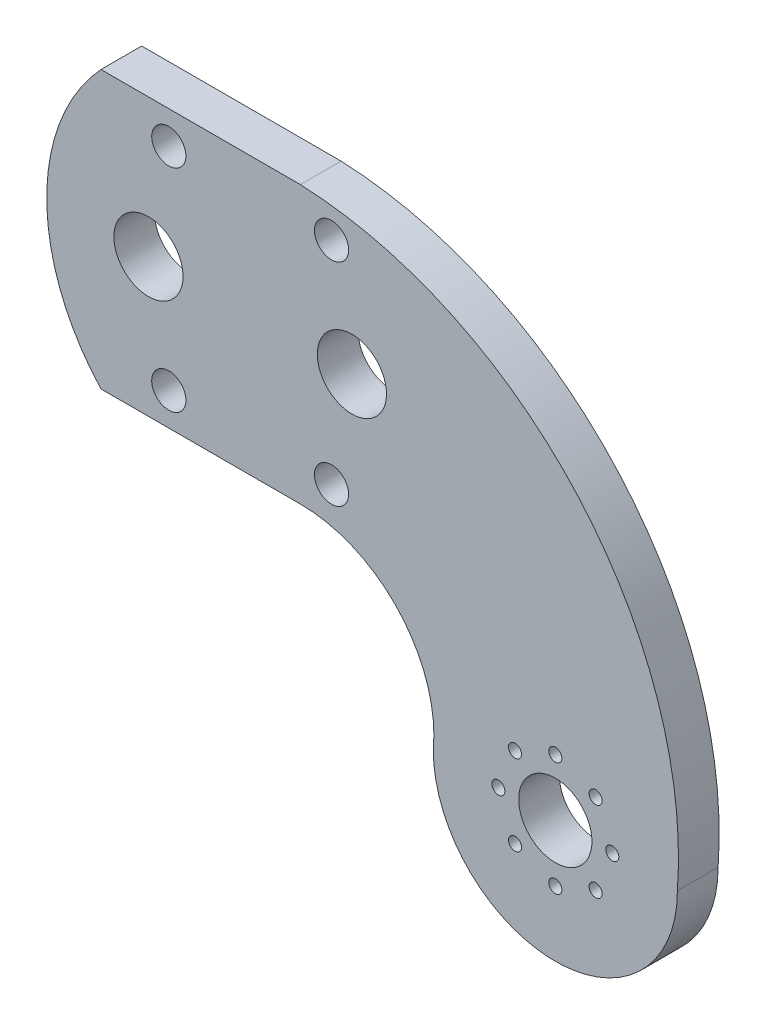
ISO-10303-21;
HEADER;
FILE_DESCRIPTION(('STEP AP214'),'2;1');
FILE_NAME('part.step','',(''),(''),'','','');
FILE_SCHEMA(('AUTOMOTIVE_DESIGN { 1 0 10303 214 1 1 1 1 }'));
ENDSEC;
DATA;
#1=APPLICATION_CONTEXT('core data for automotive mechanical design processes');
#2=APPLICATION_PROTOCOL_DEFINITION('international standard','automotive_design',2000,#1);
#3=PRODUCT_CONTEXT('',#1,'mechanical');
#4=PRODUCT('Part','Part','',(#3));
#5=PRODUCT_RELATED_PRODUCT_CATEGORY('part','',(#4));
#6=PRODUCT_DEFINITION_FORMATION('','',#4);
#7=PRODUCT_DEFINITION_CONTEXT('part definition',#1,'design');
#8=PRODUCT_DEFINITION('design','',#6,#7);
#9=PRODUCT_DEFINITION_SHAPE('','',#8);
#10=(LENGTH_UNIT() NAMED_UNIT(*) SI_UNIT(.MILLI.,.METRE.));
#11=(NAMED_UNIT(*) PLANE_ANGLE_UNIT() SI_UNIT($,.RADIAN.));
#12=(NAMED_UNIT(*) SI_UNIT($,.STERADIAN.) SOLID_ANGLE_UNIT());
#13=UNCERTAINTY_MEASURE_WITH_UNIT(LENGTH_MEASURE(1.E-05),#10,'distance_accuracy_value','');
#14=(GEOMETRIC_REPRESENTATION_CONTEXT(3) GLOBAL_UNCERTAINTY_ASSIGNED_CONTEXT((#13)) GLOBAL_UNIT_ASSIGNED_CONTEXT((#10,
#11,#12)) REPRESENTATION_CONTEXT('',''));
#15=CARTESIAN_POINT('',(0.,0.,0.));
#16=DIRECTION('',(0.,0.,1.));
#17=DIRECTION('',(1.,0.,0.));
#18=AXIS2_PLACEMENT_3D('',#15,#16,#17);
#19=CARTESIAN_POINT('',(-8.33060356798812,-31.4216530640273,5.));
#20=DIRECTION('',(0.,0.,-1.));
#21=DIRECTION('',(-1.,0.,0.));
#22=AXIS2_PLACEMENT_3D('',#19,#20,#21);
#23=CYLINDRICAL_SURFACE('',#22,48.4628910408801);
#24=CARTESIAN_POINT('',(-8.33060356798812,-31.4216530640273,0.));
#25=DIRECTION('',(0.,0.,1.));
#26=DIRECTION('',(1.,0.,0.));
#27=AXIS2_PLACEMENT_3D('',#24,#25,#26);
#28=CIRCLE('',#27,48.4628910408801);
#29=CARTESIAN_POINT('',(-6.33177326323588,17.,0.));
#30=VERTEX_POINT('',#29);
#31=CARTESIAN_POINT('',(40.,-35.,0.));
#32=VERTEX_POINT('',#31);
#33=EDGE_CURVE('E161',#30,#32,#28,.F.);
#34=ORIENTED_EDGE('',*,*,#33,.F.);
#35=DIRECTION('',(0.,0.,-1.));
#36=VECTOR('',#35,1.);
#37=CARTESIAN_POINT('',(-6.33177326323588,17.,5.));
#38=LINE('',#37,#36);
#39=CARTESIAN_POINT('',(-6.33177326323588,17.,5.));
#40=VERTEX_POINT('',#39);
#41=EDGE_CURVE('E11',#40,#30,#38,.T.);
#42=ORIENTED_EDGE('',*,*,#41,.F.);
#43=CARTESIAN_POINT('',(-8.33060356798812,-31.4216530640273,5.));
#44=DIRECTION('',(0.,0.,1.));
#45=DIRECTION('',(1.,0.,0.));
#46=AXIS2_PLACEMENT_3D('',#43,#44,#45);
#47=CIRCLE('',#46,48.4628910408801);
#48=CARTESIAN_POINT('',(40.,-35.,5.));
#49=VERTEX_POINT('',#48);
#50=EDGE_CURVE('E218',#40,#49,#47,.F.);
#51=ORIENTED_EDGE('',*,*,#50,.T.);
#52=DIRECTION('',(0.,0.,-1.));
#53=VECTOR('',#52,1.);
#54=CARTESIAN_POINT('',(40.,-35.,5.));
#55=LINE('',#54,#53);
#56=EDGE_CURVE('E79',#49,#32,#55,.T.);
#57=ORIENTED_EDGE('',*,*,#56,.T.);
#58=EDGE_LOOP('',(#34,#42,#51,#57));
#59=FACE_BOUND('',#58,.T.);
#60=ADVANCED_FACE('F34',(#59),#23,.T.);
#61=CARTESIAN_POINT('',(0.,17.,5.));
#62=DIRECTION('',(0.,1.,0.));
#63=DIRECTION('',(0.,0.,1.));
#64=AXIS2_PLACEMENT_3D('',#61,#62,#63);
#65=PLANE('',#64);
#66=DIRECTION('',(1.,0.,0.));
#67=VECTOR('',#66,1.);
#68=CARTESIAN_POINT('',(0.,17.,0.));
#69=LINE('',#68,#67);
#70=CARTESIAN_POINT('',(-30.8303027798234,17.,0.));
#71=VERTEX_POINT('',#70);
#72=EDGE_CURVE('E164',#71,#30,#69,.T.);
#73=ORIENTED_EDGE('',*,*,#72,.F.);
#74=DIRECTION('',(0.,0.,-1.));
#75=VECTOR('',#74,1.);
#76=CARTESIAN_POINT('',(-30.8303027798234,17.,5.));
#77=LINE('',#76,#75);
#78=CARTESIAN_POINT('',(-30.8303027798234,17.,5.));
#79=VERTEX_POINT('',#78);
#80=EDGE_CURVE('E42',#79,#71,#77,.T.);
#81=ORIENTED_EDGE('',*,*,#80,.F.);
#82=DIRECTION('',(1.,0.,0.));
#83=VECTOR('',#82,1.);
#84=CARTESIAN_POINT('',(0.,17.,5.));
#85=LINE('',#84,#83);
#86=EDGE_CURVE('E231',#79,#40,#85,.T.);
#87=ORIENTED_EDGE('',*,*,#86,.T.);
#88=ORIENTED_EDGE('',*,*,#41,.T.);
#89=EDGE_LOOP('',(#73,#81,#87,#88));
#90=FACE_BOUND('',#89,.T.);
#91=ADVANCED_FACE('F230',(#90),#65,.T.);
#92=CARTESIAN_POINT('',(-12.5,0.,5.));
#93=DIRECTION('',(0.,0.,-1.));
#94=DIRECTION('',(-1.,0.,0.));
#95=AXIS2_PLACEMENT_3D('',#92,#93,#94);
#96=CYLINDRICAL_SURFACE('',#95,25.);
#97=CARTESIAN_POINT('',(-12.5,0.,0.));
#98=DIRECTION('',(0.,0.,1.));
#99=DIRECTION('',(1.,0.,0.));
#100=AXIS2_PLACEMENT_3D('',#97,#98,#99);
#101=CIRCLE('',#100,25.);
#102=CARTESIAN_POINT('',(-30.8303027798234,-17.,0.));
#103=VERTEX_POINT('',#102);
#104=EDGE_CURVE('E167',#71,#103,#101,.T.);
#105=ORIENTED_EDGE('',*,*,#104,.T.);
#106=DIRECTION('',(0.,0.,-1.));
#107=VECTOR('',#106,1.);
#108=CARTESIAN_POINT('',(-30.8303027798234,-17.,5.));
#109=LINE('',#108,#107);
#110=CARTESIAN_POINT('',(-30.8303027798234,-17.,5.));
#111=VERTEX_POINT('',#110);
#112=EDGE_CURVE('E108',#111,#103,#109,.T.);
#113=ORIENTED_EDGE('',*,*,#112,.F.);
#114=CARTESIAN_POINT('',(-12.5,0.,5.));
#115=DIRECTION('',(0.,0.,1.));
#116=DIRECTION('',(1.,0.,0.));
#117=AXIS2_PLACEMENT_3D('',#114,#115,#116);
#118=CIRCLE('',#117,25.);
#119=EDGE_CURVE('E99',#79,#111,#118,.T.);
#120=ORIENTED_EDGE('',*,*,#119,.F.);
#121=ORIENTED_EDGE('',*,*,#80,.T.);
#122=EDGE_LOOP('',(#105,#113,#120,#121));
#123=FACE_BOUND('',#122,.T.);
#124=ADVANCED_FACE('F223',(#123),#96,.T.);
#125=CARTESIAN_POINT('',(0.,-17.,5.));
#126=DIRECTION('',(0.,1.,0.));
#127=DIRECTION('',(0.,0.,1.));
#128=AXIS2_PLACEMENT_3D('',#125,#126,#127);
#129=PLANE('',#128);
#130=DIRECTION('',(1.,0.,0.));
#131=VECTOR('',#130,1.);
#132=CARTESIAN_POINT('',(0.,-17.,0.));
#133=LINE('',#132,#131);
#134=CARTESIAN_POINT('',(-6.33177326323588,-17.,0.));
#135=VERTEX_POINT('',#134);
#136=EDGE_CURVE('E107',#103,#135,#133,.T.);
#137=ORIENTED_EDGE('',*,*,#136,.T.);
#138=DIRECTION('',(0.,0.,-1.));
#139=VECTOR('',#138,1.);
#140=CARTESIAN_POINT('',(-6.33177326323588,-17.,5.));
#141=LINE('',#140,#139);
#142=CARTESIAN_POINT('',(-6.33177326323588,-17.,5.));
#143=VERTEX_POINT('',#142);
#144=EDGE_CURVE('E104',#143,#135,#141,.T.);
#145=ORIENTED_EDGE('',*,*,#144,.F.);
#146=DIRECTION('',(1.,0.,0.));
#147=VECTOR('',#146,1.);
#148=CARTESIAN_POINT('',(0.,-17.,5.));
#149=LINE('',#148,#147);
#150=EDGE_CURVE('E91',#111,#143,#149,.T.);
#151=ORIENTED_EDGE('',*,*,#150,.F.);
#152=ORIENTED_EDGE('',*,*,#112,.T.);
#153=EDGE_LOOP('',(#137,#145,#151,#152));
#154=FACE_BOUND('',#153,.T.);
#155=ADVANCED_FACE('F105',(#154),#129,.F.);
#156=CARTESIAN_POINT('',(-6.33180988003462,-33.4091114987849,5.));
#157=DIRECTION('',(0.,0.,-1.));
#158=DIRECTION('',(-1.,0.,0.));
#159=AXIS2_PLACEMENT_3D('',#156,#157,#158);
#160=CYLINDRICAL_SURFACE('',#159,16.4091114988257);
#161=CARTESIAN_POINT('',(-6.33180988003462,-33.4091114987849,0.));
#162=DIRECTION('',(0.,0.,1.));
#163=DIRECTION('',(1.,0.,0.));
#164=AXIS2_PLACEMENT_3D('',#161,#162,#163);
#165=CIRCLE('',#164,16.4091114988257);
#166=CARTESIAN_POINT('',(9.99999999999997,-35.,0.));
#167=VERTEX_POINT('',#166);
#168=EDGE_CURVE('E72',#135,#167,#165,.F.);
#169=ORIENTED_EDGE('',*,*,#168,.T.);
#170=DIRECTION('',(0.,0.,-1.));
#171=VECTOR('',#170,1.);
#172=CARTESIAN_POINT('',(9.99999999999997,-35.,5.));
#173=LINE('',#172,#171);
#174=CARTESIAN_POINT('',(9.99999999999997,-35.,5.));
#175=VERTEX_POINT('',#174);
#176=EDGE_CURVE('E109',#175,#167,#173,.T.);
#177=ORIENTED_EDGE('',*,*,#176,.F.);
#178=CARTESIAN_POINT('',(-6.33180988003462,-33.4091114987849,5.));
#179=DIRECTION('',(0.,0.,1.));
#180=DIRECTION('',(1.,0.,0.));
#181=AXIS2_PLACEMENT_3D('',#178,#179,#180);
#182=CIRCLE('',#181,16.4091114988257);
#183=EDGE_CURVE('E96',#143,#175,#182,.F.);
#184=ORIENTED_EDGE('',*,*,#183,.F.);
#185=ORIENTED_EDGE('',*,*,#144,.T.);
#186=EDGE_LOOP('',(#169,#177,#184,#185));
#187=FACE_BOUND('',#186,.T.);
#188=ADVANCED_FACE('F111',(#187),#160,.F.);
#189=CARTESIAN_POINT('',(20.0502525316942,-30.0502525316942,5.));
#190=DIRECTION('',(0.,0.,-1.));
#191=DIRECTION('',(-1.,0.,0.));
#192=AXIS2_PLACEMENT_3D('',#189,#190,#191);
#193=CYLINDRICAL_SURFACE('',#192,0.800000000000002);
#194=CARTESIAN_POINT('',(20.0502525316942,-30.0502525316942,5.));
#195=DIRECTION('',(0.,0.,1.));
#196=DIRECTION('',(1.,0.,0.));
#197=AXIS2_PLACEMENT_3D('',#194,#195,#196);
#198=CIRCLE('',#197,0.800000000000002);
#199=CARTESIAN_POINT('',(20.8502525316942,-30.0502525316942,5.));
#200=VERTEX_POINT('',#199);
#201=EDGE_CURVE('E155',#200,#200,#198,.T.);
#202=ORIENTED_EDGE('',*,*,#201,.T.);
#203=EDGE_LOOP('',(#202));
#204=FACE_BOUND('',#203,.T.);
#205=CARTESIAN_POINT('',(20.0502525316942,-30.0502525316942,0.));
#206=DIRECTION('',(0.,0.,1.));
#207=DIRECTION('',(1.,0.,0.));
#208=AXIS2_PLACEMENT_3D('',#205,#206,#207);
#209=CIRCLE('',#208,0.800000000000002);
#210=CARTESIAN_POINT('',(20.8502525316942,-30.0502525316942,0.));
#211=VERTEX_POINT('',#210);
#212=EDGE_CURVE('E212',#211,#211,#209,.T.);
#213=ORIENTED_EDGE('',*,*,#212,.F.);
#214=EDGE_LOOP('',(#213));
#215=FACE_BOUND('',#214,.T.);
#216=ADVANCED_FACE('F262',(#204,#215),#193,.F.);
#217=CARTESIAN_POINT('',(18.,-35.,5.));
#218=DIRECTION('',(0.,0.,-1.));
#219=DIRECTION('',(-1.,0.,0.));
#220=AXIS2_PLACEMENT_3D('',#217,#218,#219);
#221=CYLINDRICAL_SURFACE('',#220,0.8);
#222=CARTESIAN_POINT('',(18.,-35.,5.));
#223=DIRECTION('',(0.,0.,1.));
#224=DIRECTION('',(1.,0.,0.));
#225=AXIS2_PLACEMENT_3D('',#222,#223,#224);
#226=CIRCLE('',#225,0.8);
#227=CARTESIAN_POINT('',(18.8,-35.,5.));
#228=VERTEX_POINT('',#227);
#229=EDGE_CURVE('E152',#228,#228,#226,.T.);
#230=ORIENTED_EDGE('',*,*,#229,.T.);
#231=EDGE_LOOP('',(#230));
#232=FACE_BOUND('',#231,.T.);
#233=CARTESIAN_POINT('',(18.,-35.,0.));
#234=DIRECTION('',(0.,0.,1.));
#235=DIRECTION('',(1.,0.,0.));
#236=AXIS2_PLACEMENT_3D('',#233,#234,#235);
#237=CIRCLE('',#236,0.8);
#238=CARTESIAN_POINT('',(18.8,-35.,0.));
#239=VERTEX_POINT('',#238);
#240=EDGE_CURVE('E209',#239,#239,#237,.T.);
#241=ORIENTED_EDGE('',*,*,#240,.F.);
#242=EDGE_LOOP('',(#241));
#243=FACE_BOUND('',#242,.T.);
#244=ADVANCED_FACE('F266',(#232,#243),#221,.F.);
#245=CARTESIAN_POINT('',(20.0502525316941,-39.9497474683058,5.));
#246=DIRECTION('',(0.,0.,-1.));
#247=DIRECTION('',(-1.,0.,0.));
#248=AXIS2_PLACEMENT_3D('',#245,#246,#247);
#249=CYLINDRICAL_SURFACE('',#248,0.800000000000002);
#250=CARTESIAN_POINT('',(20.0502525316941,-39.9497474683058,5.));
#251=DIRECTION('',(0.,0.,1.));
#252=DIRECTION('',(1.,0.,0.));
#253=AXIS2_PLACEMENT_3D('',#250,#251,#252);
#254=CIRCLE('',#253,0.800000000000002);
#255=CARTESIAN_POINT('',(20.8502525316941,-39.9497474683058,5.));
#256=VERTEX_POINT('',#255);
#257=EDGE_CURVE('E149',#256,#256,#254,.T.);
#258=ORIENTED_EDGE('',*,*,#257,.T.);
#259=EDGE_LOOP('',(#258));
#260=FACE_BOUND('',#259,.T.);
#261=CARTESIAN_POINT('',(20.0502525316941,-39.9497474683058,0.));
#262=DIRECTION('',(0.,0.,1.));
#263=DIRECTION('',(1.,0.,0.));
#264=AXIS2_PLACEMENT_3D('',#261,#262,#263);
#265=CIRCLE('',#264,0.800000000000002);
#266=CARTESIAN_POINT('',(20.8502525316941,-39.9497474683058,0.));
#267=VERTEX_POINT('',#266);
#268=EDGE_CURVE('E206',#267,#267,#265,.T.);
#269=ORIENTED_EDGE('',*,*,#268,.F.);
#270=EDGE_LOOP('',(#269));
#271=FACE_BOUND('',#270,.T.);
#272=ADVANCED_FACE('F272',(#260,#271),#249,.F.);
#273=CARTESIAN_POINT('',(24.9999999999999,-42.,5.));
#274=DIRECTION('',(0.,0.,-1.));
#275=DIRECTION('',(-1.,0.,0.));
#276=AXIS2_PLACEMENT_3D('',#273,#274,#275);
#277=CYLINDRICAL_SURFACE('',#276,0.799999999999999);
#278=CARTESIAN_POINT('',(24.9999999999999,-42.,5.));
#279=DIRECTION('',(0.,0.,1.));
#280=DIRECTION('',(1.,0.,0.));
#281=AXIS2_PLACEMENT_3D('',#278,#279,#280);
#282=CIRCLE('',#281,0.799999999999999);
#283=CARTESIAN_POINT('',(25.7999999999999,-42.,5.));
#284=VERTEX_POINT('',#283);
#285=EDGE_CURVE('E146',#284,#284,#282,.T.);
#286=ORIENTED_EDGE('',*,*,#285,.T.);
#287=EDGE_LOOP('',(#286));
#288=FACE_BOUND('',#287,.T.);
#289=CARTESIAN_POINT('',(24.9999999999999,-42.,0.));
#290=DIRECTION('',(0.,0.,1.));
#291=DIRECTION('',(1.,0.,0.));
#292=AXIS2_PLACEMENT_3D('',#289,#290,#291);
#293=CIRCLE('',#292,0.799999999999999);
#294=CARTESIAN_POINT('',(25.7999999999999,-42.,0.));
#295=VERTEX_POINT('',#294);
#296=EDGE_CURVE('E203',#295,#295,#293,.T.);
#297=ORIENTED_EDGE('',*,*,#296,.F.);
#298=EDGE_LOOP('',(#297));
#299=FACE_BOUND('',#298,.T.);
#300=ADVANCED_FACE('F280',(#288,#299),#277,.F.);
#301=CARTESIAN_POINT('',(29.9497474683058,-39.9497474683059,5.));
#302=DIRECTION('',(0.,0.,-1.));
#303=DIRECTION('',(-1.,0.,0.));
#304=AXIS2_PLACEMENT_3D('',#301,#302,#303);
#305=CYLINDRICAL_SURFACE('',#304,0.799999999999999);
#306=CARTESIAN_POINT('',(29.9497474683058,-39.9497474683059,5.));
#307=DIRECTION('',(0.,0.,1.));
#308=DIRECTION('',(1.,0.,0.));
#309=AXIS2_PLACEMENT_3D('',#306,#307,#308);
#310=CIRCLE('',#309,0.799999999999999);
#311=CARTESIAN_POINT('',(30.7497474683058,-39.9497474683059,5.));
#312=VERTEX_POINT('',#311);
#313=EDGE_CURVE('E143',#312,#312,#310,.T.);
#314=ORIENTED_EDGE('',*,*,#313,.T.);
#315=EDGE_LOOP('',(#314));
#316=FACE_BOUND('',#315,.T.);
#317=CARTESIAN_POINT('',(29.9497474683058,-39.9497474683059,0.));
#318=DIRECTION('',(0.,0.,1.));
#319=DIRECTION('',(1.,0.,0.));
#320=AXIS2_PLACEMENT_3D('',#317,#318,#319);
#321=CIRCLE('',#320,0.799999999999999);
#322=CARTESIAN_POINT('',(30.7497474683058,-39.9497474683059,0.));
#323=VERTEX_POINT('',#322);
#324=EDGE_CURVE('E200',#323,#323,#321,.T.);
#325=ORIENTED_EDGE('',*,*,#324,.F.);
#326=EDGE_LOOP('',(#325));
#327=FACE_BOUND('',#326,.T.);
#328=ADVANCED_FACE('F284',(#316,#327),#305,.F.);
#329=CARTESIAN_POINT('',(32.,-35.,5.));
#330=DIRECTION('',(0.,0.,-1.));
#331=DIRECTION('',(-1.,0.,0.));
#332=AXIS2_PLACEMENT_3D('',#329,#330,#331);
#333=CYLINDRICAL_SURFACE('',#332,0.800000000000004);
#334=CARTESIAN_POINT('',(32.,-35.,5.));
#335=DIRECTION('',(0.,0.,1.));
#336=DIRECTION('',(1.,0.,0.));
#337=AXIS2_PLACEMENT_3D('',#334,#335,#336);
#338=CIRCLE('',#337,0.800000000000004);
#339=CARTESIAN_POINT('',(32.8,-35.,5.));
#340=VERTEX_POINT('',#339);
#341=EDGE_CURVE('E140',#340,#340,#338,.T.);
#342=ORIENTED_EDGE('',*,*,#341,.T.);
#343=EDGE_LOOP('',(#342));
#344=FACE_BOUND('',#343,.T.);
#345=CARTESIAN_POINT('',(32.,-35.,0.));
#346=DIRECTION('',(0.,0.,1.));
#347=DIRECTION('',(1.,0.,0.));
#348=AXIS2_PLACEMENT_3D('',#345,#346,#347);
#349=CIRCLE('',#348,0.800000000000004);
#350=CARTESIAN_POINT('',(32.8,-35.,0.));
#351=VERTEX_POINT('',#350);
#352=EDGE_CURVE('E197',#351,#351,#349,.T.);
#353=ORIENTED_EDGE('',*,*,#352,.F.);
#354=EDGE_LOOP('',(#353));
#355=FACE_BOUND('',#354,.T.);
#356=ADVANCED_FACE('F288',(#344,#355),#333,.F.);
#357=CARTESIAN_POINT('',(29.9497474683059,-30.0502525316942,5.));
#358=DIRECTION('',(0.,0.,-1.));
#359=DIRECTION('',(-1.,0.,0.));
#360=AXIS2_PLACEMENT_3D('',#357,#358,#359);
#361=CYLINDRICAL_SURFACE('',#360,0.799999999999999);
#362=CARTESIAN_POINT('',(29.9497474683059,-30.0502525316942,5.));
#363=DIRECTION('',(0.,0.,1.));
#364=DIRECTION('',(1.,0.,0.));
#365=AXIS2_PLACEMENT_3D('',#362,#363,#364);
#366=CIRCLE('',#365,0.799999999999999);
#367=CARTESIAN_POINT('',(30.7497474683059,-30.0502525316942,5.));
#368=VERTEX_POINT('',#367);
#369=EDGE_CURVE('E137',#368,#368,#366,.T.);
#370=ORIENTED_EDGE('',*,*,#369,.T.);
#371=EDGE_LOOP('',(#370));
#372=FACE_BOUND('',#371,.T.);
#373=CARTESIAN_POINT('',(29.9497474683059,-30.0502525316942,0.));
#374=DIRECTION('',(0.,0.,1.));
#375=DIRECTION('',(1.,0.,0.));
#376=AXIS2_PLACEMENT_3D('',#373,#374,#375);
#377=CIRCLE('',#376,0.799999999999999);
#378=CARTESIAN_POINT('',(30.7497474683059,-30.0502525316942,0.));
#379=VERTEX_POINT('',#378);
#380=EDGE_CURVE('E194',#379,#379,#377,.T.);
#381=ORIENTED_EDGE('',*,*,#380,.F.);
#382=EDGE_LOOP('',(#381));
#383=FACE_BOUND('',#382,.T.);
#384=ADVANCED_FACE('F292',(#372,#383),#361,.F.);
#385=CARTESIAN_POINT('',(25.,-28.,5.));
#386=DIRECTION('',(0.,0.,-1.));
#387=DIRECTION('',(-1.,0.,0.));
#388=AXIS2_PLACEMENT_3D('',#385,#386,#387);
#389=CYLINDRICAL_SURFACE('',#388,0.800000000000002);
#390=CARTESIAN_POINT('',(25.,-28.,5.));
#391=DIRECTION('',(0.,0.,1.));
#392=DIRECTION('',(1.,0.,0.));
#393=AXIS2_PLACEMENT_3D('',#390,#391,#392);
#394=CIRCLE('',#393,0.800000000000002);
#395=CARTESIAN_POINT('',(25.8,-28.,5.));
#396=VERTEX_POINT('',#395);
#397=EDGE_CURVE('E134',#396,#396,#394,.T.);
#398=ORIENTED_EDGE('',*,*,#397,.T.);
#399=EDGE_LOOP('',(#398));
#400=FACE_BOUND('',#399,.T.);
#401=CARTESIAN_POINT('',(25.,-28.,0.));
#402=DIRECTION('',(0.,0.,1.));
#403=DIRECTION('',(1.,0.,0.));
#404=AXIS2_PLACEMENT_3D('',#401,#402,#403);
#405=CIRCLE('',#404,0.800000000000002);
#406=CARTESIAN_POINT('',(25.8,-28.,0.));
#407=VERTEX_POINT('',#406);
#408=EDGE_CURVE('E191',#407,#407,#405,.T.);
#409=ORIENTED_EDGE('',*,*,#408,.F.);
#410=EDGE_LOOP('',(#409));
#411=FACE_BOUND('',#410,.T.);
#412=ADVANCED_FACE('F296',(#400,#411),#389,.F.);
#413=CARTESIAN_POINT('',(-22.5,13.,5.));
#414=DIRECTION('',(0.,0.,-1.));
#415=DIRECTION('',(-1.,0.,0.));
#416=AXIS2_PLACEMENT_3D('',#413,#414,#415);
#417=CYLINDRICAL_SURFACE('',#416,2.1);
#418=CARTESIAN_POINT('',(-22.5,13.,5.));
#419=DIRECTION('',(0.,0.,1.));
#420=DIRECTION('',(1.,0.,0.));
#421=AXIS2_PLACEMENT_3D('',#418,#419,#420);
#422=CIRCLE('',#421,2.1);
#423=CARTESIAN_POINT('',(-20.4,13.,5.));
#424=VERTEX_POINT('',#423);
#425=EDGE_CURVE('E131',#424,#424,#422,.F.);
#426=ORIENTED_EDGE('',*,*,#425,.F.);
#427=EDGE_LOOP('',(#426));
#428=FACE_BOUND('',#427,.T.);
#429=CARTESIAN_POINT('',(-22.5,13.,0.));
#430=DIRECTION('',(0.,0.,1.));
#431=DIRECTION('',(1.,0.,0.));
#432=AXIS2_PLACEMENT_3D('',#429,#430,#431);
#433=CIRCLE('',#432,2.1);
#434=CARTESIAN_POINT('',(-20.4,13.,0.));
#435=VERTEX_POINT('',#434);
#436=EDGE_CURVE('E188',#435,#435,#433,.F.);
#437=ORIENTED_EDGE('',*,*,#436,.T.);
#438=EDGE_LOOP('',(#437));
#439=FACE_BOUND('',#438,.T.);
#440=ADVANCED_FACE('F300',(#428,#439),#417,.F.);
#441=CARTESIAN_POINT('',(-2.5,13.,5.));
#442=DIRECTION('',(0.,0.,-1.));
#443=DIRECTION('',(-1.,0.,0.));
#444=AXIS2_PLACEMENT_3D('',#441,#442,#443);
#445=CYLINDRICAL_SURFACE('',#444,2.1);
#446=CARTESIAN_POINT('',(-2.5,13.,5.));
#447=DIRECTION('',(0.,0.,1.));
#448=DIRECTION('',(1.,0.,0.));
#449=AXIS2_PLACEMENT_3D('',#446,#447,#448);
#450=CIRCLE('',#449,2.1);
#451=CARTESIAN_POINT('',(-0.399999999999998,13.,5.));
#452=VERTEX_POINT('',#451);
#453=EDGE_CURVE('E128',#452,#452,#450,.T.);
#454=ORIENTED_EDGE('',*,*,#453,.T.);
#455=EDGE_LOOP('',(#454));
#456=FACE_BOUND('',#455,.T.);
#457=CARTESIAN_POINT('',(-2.5,13.,0.));
#458=DIRECTION('',(0.,0.,1.));
#459=DIRECTION('',(1.,0.,0.));
#460=AXIS2_PLACEMENT_3D('',#457,#458,#459);
#461=CIRCLE('',#460,2.1);
#462=CARTESIAN_POINT('',(-0.399999999999998,13.,0.));
#463=VERTEX_POINT('',#462);
#464=EDGE_CURVE('E185',#463,#463,#461,.T.);
#465=ORIENTED_EDGE('',*,*,#464,.F.);
#466=EDGE_LOOP('',(#465));
#467=FACE_BOUND('',#466,.T.);
#468=ADVANCED_FACE('F304',(#456,#467),#445,.F.);
#469=CARTESIAN_POINT('',(0.,0.,5.));
#470=DIRECTION('',(0.,0.,-1.));
#471=DIRECTION('',(-1.,0.,0.));
#472=AXIS2_PLACEMENT_3D('',#469,#470,#471);
#473=CYLINDRICAL_SURFACE('',#472,4.25);
#474=CARTESIAN_POINT('',(0.,0.,5.));
#475=DIRECTION('',(0.,0.,1.));
#476=DIRECTION('',(1.,0.,0.));
#477=AXIS2_PLACEMENT_3D('',#474,#475,#476);
#478=CIRCLE('',#477,4.25);
#479=CARTESIAN_POINT('',(4.25,0.,5.));
#480=VERTEX_POINT('',#479);
#481=EDGE_CURVE('E125',#480,#480,#478,.T.);
#482=ORIENTED_EDGE('',*,*,#481,.T.);
#483=EDGE_LOOP('',(#482));
#484=FACE_BOUND('',#483,.T.);
#485=CARTESIAN_POINT('',(0.,0.,0.));
#486=DIRECTION('',(0.,0.,1.));
#487=DIRECTION('',(1.,0.,0.));
#488=AXIS2_PLACEMENT_3D('',#485,#486,#487);
#489=CIRCLE('',#488,4.25);
#490=CARTESIAN_POINT('',(4.25,0.,0.));
#491=VERTEX_POINT('',#490);
#492=EDGE_CURVE('E182',#491,#491,#489,.T.);
#493=ORIENTED_EDGE('',*,*,#492,.F.);
#494=EDGE_LOOP('',(#493));
#495=FACE_BOUND('',#494,.T.);
#496=ADVANCED_FACE('F308',(#484,#495),#473,.F.);
#497=CARTESIAN_POINT('',(-25.,0.,5.));
#498=DIRECTION('',(0.,0.,-1.));
#499=DIRECTION('',(-1.,0.,0.));
#500=AXIS2_PLACEMENT_3D('',#497,#498,#499);
#501=CYLINDRICAL_SURFACE('',#500,4.25);
#502=CARTESIAN_POINT('',(-25.,0.,5.));
#503=DIRECTION('',(0.,0.,1.));
#504=DIRECTION('',(1.,0.,0.));
#505=AXIS2_PLACEMENT_3D('',#502,#503,#504);
#506=CIRCLE('',#505,4.25);
#507=CARTESIAN_POINT('',(-20.75,0.,5.));
#508=VERTEX_POINT('',#507);
#509=EDGE_CURVE('E122',#508,#508,#506,.T.);
#510=ORIENTED_EDGE('',*,*,#509,.T.);
#511=EDGE_LOOP('',(#510));
#512=FACE_BOUND('',#511,.T.);
#513=CARTESIAN_POINT('',(-25.,0.,0.));
#514=DIRECTION('',(0.,0.,1.));
#515=DIRECTION('',(1.,0.,0.));
#516=AXIS2_PLACEMENT_3D('',#513,#514,#515);
#517=CIRCLE('',#516,4.25);
#518=CARTESIAN_POINT('',(-20.75,0.,0.));
#519=VERTEX_POINT('',#518);
#520=EDGE_CURVE('E179',#519,#519,#517,.T.);
#521=ORIENTED_EDGE('',*,*,#520,.F.);
#522=EDGE_LOOP('',(#521));
#523=FACE_BOUND('',#522,.T.);
#524=ADVANCED_FACE('F312',(#512,#523),#501,.F.);
#525=CARTESIAN_POINT('',(-22.5,-13.,5.));
#526=DIRECTION('',(0.,0.,-1.));
#527=DIRECTION('',(-1.,0.,0.));
#528=AXIS2_PLACEMENT_3D('',#525,#526,#527);
#529=CYLINDRICAL_SURFACE('',#528,2.1);
#530=CARTESIAN_POINT('',(-22.5,-13.,5.));
#531=DIRECTION('',(0.,0.,1.));
#532=DIRECTION('',(1.,0.,0.));
#533=AXIS2_PLACEMENT_3D('',#530,#531,#532);
#534=CIRCLE('',#533,2.1);
#535=CARTESIAN_POINT('',(-20.4,-13.,5.));
#536=VERTEX_POINT('',#535);
#537=EDGE_CURVE('E119',#536,#536,#534,.T.);
#538=ORIENTED_EDGE('',*,*,#537,.T.);
#539=EDGE_LOOP('',(#538));
#540=FACE_BOUND('',#539,.T.);
#541=CARTESIAN_POINT('',(-22.5,-13.,0.));
#542=DIRECTION('',(0.,0.,1.));
#543=DIRECTION('',(1.,0.,0.));
#544=AXIS2_PLACEMENT_3D('',#541,#542,#543);
#545=CIRCLE('',#544,2.1);
#546=CARTESIAN_POINT('',(-20.4,-13.,0.));
#547=VERTEX_POINT('',#546);
#548=EDGE_CURVE('E176',#547,#547,#545,.T.);
#549=ORIENTED_EDGE('',*,*,#548,.F.);
#550=EDGE_LOOP('',(#549));
#551=FACE_BOUND('',#550,.T.);
#552=ADVANCED_FACE('F247',(#540,#551),#529,.F.);
#553=CARTESIAN_POINT('',(-2.5,-13.,5.));
#554=DIRECTION('',(0.,0.,-1.));
#555=DIRECTION('',(-1.,0.,0.));
#556=AXIS2_PLACEMENT_3D('',#553,#554,#555);
#557=CYLINDRICAL_SURFACE('',#556,2.1);
#558=CARTESIAN_POINT('',(-2.5,-13.,5.));
#559=DIRECTION('',(0.,0.,1.));
#560=DIRECTION('',(1.,0.,0.));
#561=AXIS2_PLACEMENT_3D('',#558,#559,#560);
#562=CIRCLE('',#561,2.1);
#563=CARTESIAN_POINT('',(-0.399999999999998,-13.,5.));
#564=VERTEX_POINT('',#563);
#565=EDGE_CURVE('E113',#564,#564,#562,.F.);
#566=ORIENTED_EDGE('',*,*,#565,.F.);
#567=EDGE_LOOP('',(#566));
#568=FACE_BOUND('',#567,.T.);
#569=CARTESIAN_POINT('',(-2.5,-13.,0.));
#570=DIRECTION('',(0.,0.,1.));
#571=DIRECTION('',(1.,0.,0.));
#572=AXIS2_PLACEMENT_3D('',#569,#570,#571);
#573=CIRCLE('',#572,2.1);
#574=CARTESIAN_POINT('',(-0.399999999999998,-13.,0.));
#575=VERTEX_POINT('',#574);
#576=EDGE_CURVE('E173',#575,#575,#573,.F.);
#577=ORIENTED_EDGE('',*,*,#576,.T.);
#578=EDGE_LOOP('',(#577));
#579=FACE_BOUND('',#578,.T.);
#580=ADVANCED_FACE('F239',(#568,#579),#557,.F.);
#581=CARTESIAN_POINT('',(25.,-35.,5.));
#582=DIRECTION('',(0.,0.,-1.));
#583=DIRECTION('',(-1.,0.,0.));
#584=AXIS2_PLACEMENT_3D('',#581,#582,#583);
#585=CYLINDRICAL_SURFACE('',#584,15.);
#586=CARTESIAN_POINT('',(25.,-35.,0.));
#587=DIRECTION('',(0.,0.,1.));
#588=DIRECTION('',(1.,0.,0.));
#589=AXIS2_PLACEMENT_3D('',#586,#587,#588);
#590=CIRCLE('',#589,15.);
#591=EDGE_CURVE('E171',#167,#32,#590,.T.);
#592=ORIENTED_EDGE('',*,*,#591,.T.);
#593=ORIENTED_EDGE('',*,*,#56,.F.);
#594=CARTESIAN_POINT('',(25.,-35.,5.));
#595=DIRECTION('',(0.,0.,1.));
#596=DIRECTION('',(1.,0.,0.));
#597=AXIS2_PLACEMENT_3D('',#594,#595,#596);
#598=CIRCLE('',#597,15.);
#599=EDGE_CURVE('E50',#175,#49,#598,.T.);
#600=ORIENTED_EDGE('',*,*,#599,.F.);
#601=ORIENTED_EDGE('',*,*,#176,.T.);
#602=EDGE_LOOP('',(#592,#593,#600,#601));
#603=FACE_BOUND('',#602,.T.);
#604=ADVANCED_FACE('F234',(#603),#585,.T.);
#605=CARTESIAN_POINT('',(25.,-35.,5.));
#606=DIRECTION('',(0.,0.,-1.));
#607=DIRECTION('',(-1.,0.,0.));
#608=AXIS2_PLACEMENT_3D('',#605,#606,#607);
#609=CYLINDRICAL_SURFACE('',#608,4.5);
#610=CARTESIAN_POINT('',(25.,-35.,5.));
#611=DIRECTION('',(0.,0.,1.));
#612=DIRECTION('',(1.,0.,0.));
#613=AXIS2_PLACEMENT_3D('',#610,#611,#612);
#614=CIRCLE('',#613,4.5);
#615=CARTESIAN_POINT('',(29.5,-35.,5.));
#616=VERTEX_POINT('',#615);
#617=EDGE_CURVE('E158',#616,#616,#614,.T.);
#618=ORIENTED_EDGE('',*,*,#617,.T.);
#619=EDGE_LOOP('',(#618));
#620=FACE_BOUND('',#619,.T.);
#621=CARTESIAN_POINT('',(25.,-35.,0.));
#622=DIRECTION('',(0.,0.,1.));
#623=DIRECTION('',(1.,0.,0.));
#624=AXIS2_PLACEMENT_3D('',#621,#622,#623);
#625=CIRCLE('',#624,4.5);
#626=CARTESIAN_POINT('',(29.5,-35.,0.));
#627=VERTEX_POINT('',#626);
#628=EDGE_CURVE('E215',#627,#627,#625,.T.);
#629=ORIENTED_EDGE('',*,*,#628,.F.);
#630=EDGE_LOOP('',(#629));
#631=FACE_BOUND('',#630,.T.);
#632=ADVANCED_FACE('F238',(#620,#631),#609,.F.);
#633=CARTESIAN_POINT('',(0.,0.,5.));
#634=DIRECTION('',(0.,0.,1.));
#635=DIRECTION('',(1.,0.,0.));
#636=AXIS2_PLACEMENT_3D('',#633,#634,#635);
#637=PLANE('',#636);
#638=ORIENTED_EDGE('',*,*,#50,.F.);
#639=ORIENTED_EDGE('',*,*,#86,.F.);
#640=ORIENTED_EDGE('',*,*,#119,.T.);
#641=ORIENTED_EDGE('',*,*,#150,.T.);
#642=ORIENTED_EDGE('',*,*,#183,.T.);
#643=ORIENTED_EDGE('',*,*,#599,.T.);
#644=EDGE_LOOP('',(#638,#639,#640,#641,#642,#643));
#645=FACE_BOUND('',#644,.T.);
#646=ORIENTED_EDGE('',*,*,#565,.T.);
#647=EDGE_LOOP('',(#646));
#648=FACE_BOUND('',#647,.T.);
#649=ORIENTED_EDGE('',*,*,#537,.F.);
#650=EDGE_LOOP('',(#649));
#651=FACE_BOUND('',#650,.T.);
#652=ORIENTED_EDGE('',*,*,#509,.F.);
#653=EDGE_LOOP('',(#652));
#654=FACE_BOUND('',#653,.T.);
#655=ORIENTED_EDGE('',*,*,#481,.F.);
#656=EDGE_LOOP('',(#655));
#657=FACE_BOUND('',#656,.T.);
#658=ORIENTED_EDGE('',*,*,#453,.F.);
#659=EDGE_LOOP('',(#658));
#660=FACE_BOUND('',#659,.T.);
#661=ORIENTED_EDGE('',*,*,#425,.T.);
#662=EDGE_LOOP('',(#661));
#663=FACE_BOUND('',#662,.T.);
#664=ORIENTED_EDGE('',*,*,#397,.F.);
#665=EDGE_LOOP('',(#664));
#666=FACE_BOUND('',#665,.T.);
#667=ORIENTED_EDGE('',*,*,#369,.F.);
#668=EDGE_LOOP('',(#667));
#669=FACE_BOUND('',#668,.T.);
#670=ORIENTED_EDGE('',*,*,#341,.F.);
#671=EDGE_LOOP('',(#670));
#672=FACE_BOUND('',#671,.T.);
#673=ORIENTED_EDGE('',*,*,#313,.F.);
#674=EDGE_LOOP('',(#673));
#675=FACE_BOUND('',#674,.T.);
#676=ORIENTED_EDGE('',*,*,#285,.F.);
#677=EDGE_LOOP('',(#676));
#678=FACE_BOUND('',#677,.T.);
#679=ORIENTED_EDGE('',*,*,#257,.F.);
#680=EDGE_LOOP('',(#679));
#681=FACE_BOUND('',#680,.T.);
#682=ORIENTED_EDGE('',*,*,#229,.F.);
#683=EDGE_LOOP('',(#682));
#684=FACE_BOUND('',#683,.T.);
#685=ORIENTED_EDGE('',*,*,#201,.F.);
#686=EDGE_LOOP('',(#685));
#687=FACE_BOUND('',#686,.T.);
#688=ORIENTED_EDGE('',*,*,#617,.F.);
#689=EDGE_LOOP('',(#688));
#690=FACE_BOUND('',#689,.T.);
#691=ADVANCED_FACE('F93',(#645,#648,#651,#654,#657,#660,#663,#666,#669,#672,#675,#678,#681,#684,
#687,#690),#637,.T.);
#692=CARTESIAN_POINT('',(0.,0.,0.));
#693=DIRECTION('',(0.,0.,1.));
#694=DIRECTION('',(1.,0.,0.));
#695=AXIS2_PLACEMENT_3D('',#692,#693,#694);
#696=PLANE('',#695);
#697=ORIENTED_EDGE('',*,*,#33,.T.);
#698=ORIENTED_EDGE('',*,*,#591,.F.);
#699=ORIENTED_EDGE('',*,*,#168,.F.);
#700=ORIENTED_EDGE('',*,*,#136,.F.);
#701=ORIENTED_EDGE('',*,*,#104,.F.);
#702=ORIENTED_EDGE('',*,*,#72,.T.);
#703=EDGE_LOOP('',(#697,#698,#699,#700,#701,#702));
#704=FACE_BOUND('',#703,.T.);
#705=ORIENTED_EDGE('',*,*,#576,.F.);
#706=EDGE_LOOP('',(#705));
#707=FACE_BOUND('',#706,.T.);
#708=ORIENTED_EDGE('',*,*,#548,.T.);
#709=EDGE_LOOP('',(#708));
#710=FACE_BOUND('',#709,.T.);
#711=ORIENTED_EDGE('',*,*,#520,.T.);
#712=EDGE_LOOP('',(#711));
#713=FACE_BOUND('',#712,.T.);
#714=ORIENTED_EDGE('',*,*,#492,.T.);
#715=EDGE_LOOP('',(#714));
#716=FACE_BOUND('',#715,.T.);
#717=ORIENTED_EDGE('',*,*,#464,.T.);
#718=EDGE_LOOP('',(#717));
#719=FACE_BOUND('',#718,.T.);
#720=ORIENTED_EDGE('',*,*,#436,.F.);
#721=EDGE_LOOP('',(#720));
#722=FACE_BOUND('',#721,.T.);
#723=ORIENTED_EDGE('',*,*,#408,.T.);
#724=EDGE_LOOP('',(#723));
#725=FACE_BOUND('',#724,.T.);
#726=ORIENTED_EDGE('',*,*,#380,.T.);
#727=EDGE_LOOP('',(#726));
#728=FACE_BOUND('',#727,.T.);
#729=ORIENTED_EDGE('',*,*,#352,.T.);
#730=EDGE_LOOP('',(#729));
#731=FACE_BOUND('',#730,.T.);
#732=ORIENTED_EDGE('',*,*,#324,.T.);
#733=EDGE_LOOP('',(#732));
#734=FACE_BOUND('',#733,.T.);
#735=ORIENTED_EDGE('',*,*,#296,.T.);
#736=EDGE_LOOP('',(#735));
#737=FACE_BOUND('',#736,.T.);
#738=ORIENTED_EDGE('',*,*,#268,.T.);
#739=EDGE_LOOP('',(#738));
#740=FACE_BOUND('',#739,.T.);
#741=ORIENTED_EDGE('',*,*,#240,.T.);
#742=EDGE_LOOP('',(#741));
#743=FACE_BOUND('',#742,.T.);
#744=ORIENTED_EDGE('',*,*,#212,.T.);
#745=EDGE_LOOP('',(#744));
#746=FACE_BOUND('',#745,.T.);
#747=ORIENTED_EDGE('',*,*,#628,.T.);
#748=EDGE_LOOP('',(#747));
#749=FACE_BOUND('',#748,.T.);
#750=ADVANCED_FACE('F228',(#704,#707,#710,#713,#716,#719,#722,#725,#728,#731,#734,#737,#740,
#743,#746,#749),#696,.F.);
#751=CLOSED_SHELL('',(#60,#91,#124,#155,#188,#216,#244,#272,#300,#328,#356,#384,#412,#440,#468,
#496,#524,#552,#580,#604,#632,#691,#750));
#752=MANIFOLD_SOLID_BREP('B2',#751);
#753=ADVANCED_BREP_SHAPE_REPRESENTATION('',(#18,#752),#14);
#754=SHAPE_DEFINITION_REPRESENTATION(#9,#753);
ENDSEC;
END-ISO-10303-21;
